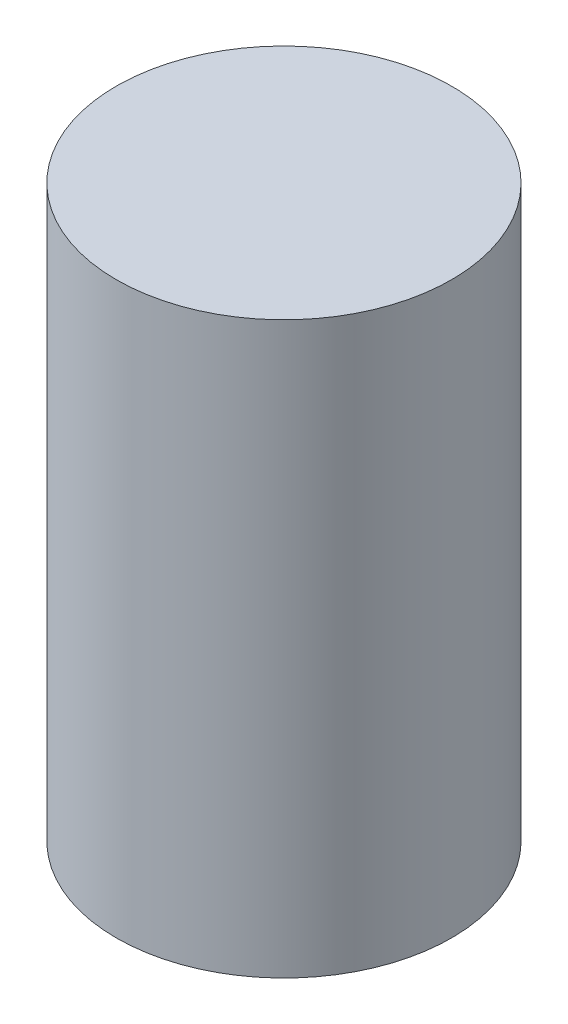
ISO-10303-21;
HEADER;
FILE_DESCRIPTION(('STEP AP214'),'2;1');
FILE_NAME('part.step','',(''),(''),'','','');
FILE_SCHEMA(('AUTOMOTIVE_DESIGN { 1 0 10303 214 1 1 1 1 }'));
ENDSEC;
DATA;
#1=APPLICATION_CONTEXT('core data for automotive mechanical design processes');
#2=APPLICATION_PROTOCOL_DEFINITION('international standard','automotive_design',2000,#1);
#3=PRODUCT_CONTEXT('',#1,'mechanical');
#4=PRODUCT('Part','Part','',(#3));
#5=PRODUCT_RELATED_PRODUCT_CATEGORY('part','',(#4));
#6=PRODUCT_DEFINITION_FORMATION('','',#4);
#7=PRODUCT_DEFINITION_CONTEXT('part definition',#1,'design');
#8=PRODUCT_DEFINITION('design','',#6,#7);
#9=PRODUCT_DEFINITION_SHAPE('','',#8);
#10=(LENGTH_UNIT() NAMED_UNIT(*) SI_UNIT(.MILLI.,.METRE.));
#11=(NAMED_UNIT(*) PLANE_ANGLE_UNIT() SI_UNIT($,.RADIAN.));
#12=(NAMED_UNIT(*) SI_UNIT($,.STERADIAN.) SOLID_ANGLE_UNIT());
#13=UNCERTAINTY_MEASURE_WITH_UNIT(LENGTH_MEASURE(1.E-05),#10,'distance_accuracy_value','');
#14=(GEOMETRIC_REPRESENTATION_CONTEXT(3) GLOBAL_UNCERTAINTY_ASSIGNED_CONTEXT((#13)) GLOBAL_UNIT_ASSIGNED_CONTEXT((#10,
#11,#12)) REPRESENTATION_CONTEXT('',''));
#15=CARTESIAN_POINT('',(0.,0.,0.));
#16=DIRECTION('',(0.,0.,1.));
#17=DIRECTION('',(1.,0.,0.));
#18=AXIS2_PLACEMENT_3D('',#15,#16,#17);
#19=CARTESIAN_POINT('',(0.,51.,0.));
#20=DIRECTION('',(0.,-1.,0.));
#21=DIRECTION('',(0.,0.,-1.));
#22=AXIS2_PLACEMENT_3D('',#19,#20,#21);
#23=CYLINDRICAL_SURFACE('',#22,15.);
#24=CARTESIAN_POINT('',(0.,51.,0.));
#25=DIRECTION('',(0.,1.,0.));
#26=DIRECTION('',(0.,0.,1.));
#27=AXIS2_PLACEMENT_3D('',#24,#25,#26);
#28=CIRCLE('',#27,15.);
#29=CARTESIAN_POINT('',(0.,51.,15.));
#30=VERTEX_POINT('',#29);
#31=EDGE_CURVE('E10',#30,#30,#28,.T.);
#32=ORIENTED_EDGE('',*,*,#31,.F.);
#33=EDGE_LOOP('',(#32));
#34=FACE_BOUND('',#33,.T.);
#35=CARTESIAN_POINT('',(0.,0.,0.));
#36=DIRECTION('',(0.,1.,0.));
#37=DIRECTION('',(0.,0.,1.));
#38=AXIS2_PLACEMENT_3D('',#35,#36,#37);
#39=CIRCLE('',#38,15.);
#40=CARTESIAN_POINT('',(0.,0.,15.));
#41=VERTEX_POINT('',#40);
#42=EDGE_CURVE('E40',#41,#41,#39,.T.);
#43=ORIENTED_EDGE('',*,*,#42,.T.);
#44=EDGE_LOOP('',(#43));
#45=FACE_BOUND('',#44,.T.);
#46=ADVANCED_FACE('F37',(#34,#45),#23,.T.);
#47=CARTESIAN_POINT('',(0.,51.,0.));
#48=DIRECTION('',(0.,1.,0.));
#49=DIRECTION('',(0.,0.,1.));
#50=AXIS2_PLACEMENT_3D('',#47,#48,#49);
#51=PLANE('',#50);
#52=ORIENTED_EDGE('',*,*,#31,.T.);
#53=EDGE_LOOP('',(#52));
#54=FACE_BOUND('',#53,.T.);
#55=ADVANCED_FACE('F54',(#54),#51,.T.);
#56=CARTESIAN_POINT('',(0.,0.,0.));
#57=DIRECTION('',(0.,1.,0.));
#58=DIRECTION('',(0.,0.,1.));
#59=AXIS2_PLACEMENT_3D('',#56,#57,#58);
#60=PLANE('',#59);
#61=ORIENTED_EDGE('',*,*,#42,.F.);
#62=EDGE_LOOP('',(#61));
#63=FACE_BOUND('',#62,.T.);
#64=ADVANCED_FACE('F52',(#63),#60,.F.);
#65=CLOSED_SHELL('',(#46,#55,#64));
#66=MANIFOLD_SOLID_BREP('B2',#65);
#67=ADVANCED_BREP_SHAPE_REPRESENTATION('',(#18,#66),#14);
#68=SHAPE_DEFINITION_REPRESENTATION(#9,#67);
ENDSEC;
END-ISO-10303-21;
